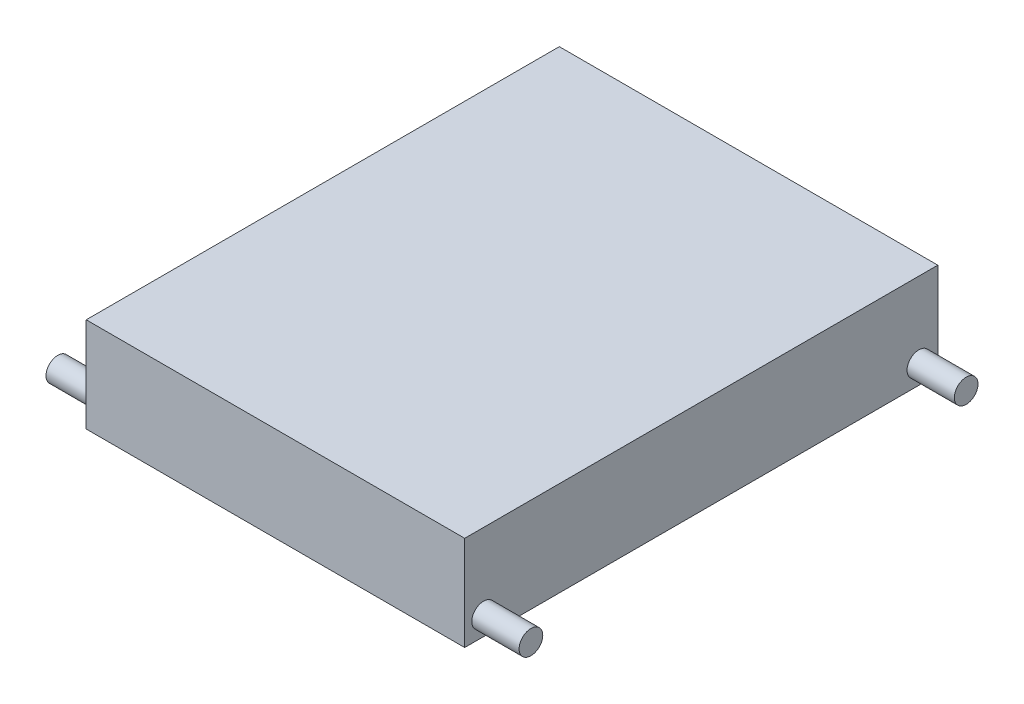
ISO-10303-21;
HEADER;
FILE_DESCRIPTION(('STEP AP214'),'2;1');
FILE_NAME('part.step','',(''),(''),'','','');
FILE_SCHEMA(('AUTOMOTIVE_DESIGN { 1 0 10303 214 1 1 1 1 }'));
ENDSEC;
DATA;
#1=APPLICATION_CONTEXT('core data for automotive mechanical design processes');
#2=APPLICATION_PROTOCOL_DEFINITION('international standard','automotive_design',2000,#1);
#3=PRODUCT_CONTEXT('',#1,'mechanical');
#4=PRODUCT('Part','Part','',(#3));
#5=PRODUCT_RELATED_PRODUCT_CATEGORY('part','',(#4));
#6=PRODUCT_DEFINITION_FORMATION('','',#4);
#7=PRODUCT_DEFINITION_CONTEXT('part definition',#1,'design');
#8=PRODUCT_DEFINITION('design','',#6,#7);
#9=PRODUCT_DEFINITION_SHAPE('','',#8);
#10=(LENGTH_UNIT() NAMED_UNIT(*) SI_UNIT(.MILLI.,.METRE.));
#11=(NAMED_UNIT(*) PLANE_ANGLE_UNIT() SI_UNIT($,.RADIAN.));
#12=(NAMED_UNIT(*) SI_UNIT($,.STERADIAN.) SOLID_ANGLE_UNIT());
#13=UNCERTAINTY_MEASURE_WITH_UNIT(LENGTH_MEASURE(1.E-05),#10,'distance_accuracy_value','');
#14=(GEOMETRIC_REPRESENTATION_CONTEXT(3) GLOBAL_UNCERTAINTY_ASSIGNED_CONTEXT((#13)) GLOBAL_UNIT_ASSIGNED_CONTEXT((#10,
#11,#12)) REPRESENTATION_CONTEXT('',''));
#15=CARTESIAN_POINT('',(0.,0.,0.));
#16=DIRECTION('',(0.,0.,1.));
#17=DIRECTION('',(1.,0.,0.));
#18=AXIS2_PLACEMENT_3D('',#15,#16,#17);
#19=CARTESIAN_POINT('',(-38.127078891258,25.4,18.3703198294243));
#20=DIRECTION('',(1.,0.,0.));
#21=DIRECTION('',(0.,0.,-1.));
#22=AXIS2_PLACEMENT_3D('',#19,#20,#21);
#23=PLANE('',#22);
#24=CARTESIAN_POINT('',(-38.127078891258,5.08,13.2903198294243));
#25=DIRECTION('',(1.,0.,0.));
#26=DIRECTION('',(0.,0.,-1.));
#27=AXIS2_PLACEMENT_3D('',#24,#25,#26);
#28=CIRCLE('',#27,3.175);
#29=CARTESIAN_POINT('',(-38.127078891258,5.08,10.1153198294243));
#30=VERTEX_POINT('',#29);
#31=EDGE_CURVE('E11',#30,#30,#28,.F.);
#32=ORIENTED_EDGE('',*,*,#31,.F.);
#33=EDGE_LOOP('',(#32));
#34=FACE_BOUND('',#33,.T.);
#35=CARTESIAN_POINT('',(-38.127078891258,5.08,-103.549680170576));
#36=DIRECTION('',(1.,0.,0.));
#37=DIRECTION('',(0.,0.,-1.));
#38=AXIS2_PLACEMENT_3D('',#35,#36,#37);
#39=CIRCLE('',#38,3.175);
#40=CARTESIAN_POINT('',(-38.127078891258,5.08,-106.724680170576));
#41=VERTEX_POINT('',#40);
#42=EDGE_CURVE('E54',#41,#41,#39,.F.);
#43=ORIENTED_EDGE('',*,*,#42,.F.);
#44=EDGE_LOOP('',(#43));
#45=FACE_BOUND('',#44,.T.);
#46=DIRECTION('',(0.,0.,1.));
#47=VECTOR('',#46,1.);
#48=CARTESIAN_POINT('',(-38.127078891258,0.,18.3703198294243));
#49=LINE('',#48,#47);
#50=CARTESIAN_POINT('',(-38.127078891258,0.,-108.629680170576));
#51=VERTEX_POINT('',#50);
#52=CARTESIAN_POINT('',(-38.127078891258,0.,18.3703198294243));
#53=VERTEX_POINT('',#52);
#54=EDGE_CURVE('E117',#51,#53,#49,.T.);
#55=ORIENTED_EDGE('',*,*,#54,.T.);
#56=DIRECTION('',(0.,-1.,0.));
#57=VECTOR('',#56,1.);
#58=CARTESIAN_POINT('',(-38.127078891258,25.4,18.3703198294243));
#59=LINE('',#58,#57);
#60=CARTESIAN_POINT('',(-38.127078891258,25.4,18.3703198294243));
#61=VERTEX_POINT('',#60);
#62=EDGE_CURVE('E106',#61,#53,#59,.T.);
#63=ORIENTED_EDGE('',*,*,#62,.F.);
#64=DIRECTION('',(0.,0.,1.));
#65=VECTOR('',#64,1.);
#66=CARTESIAN_POINT('',(-38.127078891258,25.4,18.3703198294243));
#67=LINE('',#66,#65);
#68=CARTESIAN_POINT('',(-38.127078891258,25.4,-108.629680170576));
#69=VERTEX_POINT('',#68);
#70=EDGE_CURVE('E98',#69,#61,#67,.T.);
#71=ORIENTED_EDGE('',*,*,#70,.F.);
#72=DIRECTION('',(0.,-1.,0.));
#73=VECTOR('',#72,1.);
#74=CARTESIAN_POINT('',(-38.127078891258,25.4,-108.629680170576));
#75=LINE('',#74,#73);
#76=EDGE_CURVE('E113',#69,#51,#75,.T.);
#77=ORIENTED_EDGE('',*,*,#76,.T.);
#78=EDGE_LOOP('',(#55,#63,#71,#77));
#79=FACE_BOUND('',#78,.T.);
#80=ADVANCED_FACE('F45',(#34,#45,#79),#23,.F.);
#81=CARTESIAN_POINT('',(-38.127078891258,25.4,18.3703198294243));
#82=DIRECTION('',(0.,0.,-1.));
#83=DIRECTION('',(-1.,0.,0.));
#84=AXIS2_PLACEMENT_3D('',#81,#82,#83);
#85=PLANE('',#84);
#86=DIRECTION('',(1.,0.,0.));
#87=VECTOR('',#86,1.);
#88=CARTESIAN_POINT('',(-38.127078891258,0.,18.3703198294243));
#89=LINE('',#88,#87);
#90=CARTESIAN_POINT('',(63.472921108742,0.,18.3703198294243));
#91=VERTEX_POINT('',#90);
#92=EDGE_CURVE('E104',#53,#91,#89,.T.);
#93=ORIENTED_EDGE('',*,*,#92,.T.);
#94=DIRECTION('',(0.,-1.,0.));
#95=VECTOR('',#94,1.);
#96=CARTESIAN_POINT('',(63.472921108742,25.4,18.3703198294243));
#97=LINE('',#96,#95);
#98=CARTESIAN_POINT('',(63.472921108742,25.4,18.3703198294243));
#99=VERTEX_POINT('',#98);
#100=EDGE_CURVE('E102',#99,#91,#97,.T.);
#101=ORIENTED_EDGE('',*,*,#100,.F.);
#102=DIRECTION('',(1.,0.,0.));
#103=VECTOR('',#102,1.);
#104=CARTESIAN_POINT('',(-38.127078891258,25.4,18.3703198294243));
#105=LINE('',#104,#103);
#106=EDGE_CURVE('E93',#61,#99,#105,.T.);
#107=ORIENTED_EDGE('',*,*,#106,.F.);
#108=ORIENTED_EDGE('',*,*,#62,.T.);
#109=EDGE_LOOP('',(#93,#101,#107,#108));
#110=FACE_BOUND('',#109,.T.);
#111=ADVANCED_FACE('F103',(#110),#85,.F.);
#112=CARTESIAN_POINT('',(63.472921108742,25.4,18.3703198294243));
#113=DIRECTION('',(-1.,0.,0.));
#114=DIRECTION('',(0.,0.,1.));
#115=AXIS2_PLACEMENT_3D('',#112,#113,#114);
#116=PLANE('',#115);
#117=CARTESIAN_POINT('',(63.472921108742,5.08,-103.549680170576));
#118=DIRECTION('',(-1.,0.,0.));
#119=DIRECTION('',(0.,0.,1.));
#120=AXIS2_PLACEMENT_3D('',#117,#118,#119);
#121=CIRCLE('',#120,3.175);
#122=CARTESIAN_POINT('',(63.472921108742,5.08,-100.374680170576));
#123=VERTEX_POINT('',#122);
#124=EDGE_CURVE('E138',#123,#123,#121,.F.);
#125=ORIENTED_EDGE('',*,*,#124,.F.);
#126=EDGE_LOOP('',(#125));
#127=FACE_BOUND('',#126,.T.);
#128=CARTESIAN_POINT('',(63.472921108742,5.08,13.2903198294243));
#129=DIRECTION('',(-1.,0.,0.));
#130=DIRECTION('',(0.,0.,1.));
#131=AXIS2_PLACEMENT_3D('',#128,#129,#130);
#132=CIRCLE('',#131,3.175);
#133=CARTESIAN_POINT('',(63.472921108742,5.08,16.4653198294243));
#134=VERTEX_POINT('',#133);
#135=EDGE_CURVE('E134',#134,#134,#132,.F.);
#136=ORIENTED_EDGE('',*,*,#135,.F.);
#137=EDGE_LOOP('',(#136));
#138=FACE_BOUND('',#137,.T.);
#139=DIRECTION('',(0.,0.,-1.));
#140=VECTOR('',#139,1.);
#141=CARTESIAN_POINT('',(63.472921108742,0.,18.3703198294243));
#142=LINE('',#141,#140);
#143=CARTESIAN_POINT('',(63.472921108742,0.,-108.629680170576));
#144=VERTEX_POINT('',#143);
#145=EDGE_CURVE('E79',#91,#144,#142,.T.);
#146=ORIENTED_EDGE('',*,*,#145,.T.);
#147=DIRECTION('',(0.,-1.,0.));
#148=VECTOR('',#147,1.);
#149=CARTESIAN_POINT('',(63.472921108742,25.4,-108.629680170576));
#150=LINE('',#149,#148);
#151=CARTESIAN_POINT('',(63.472921108742,25.4,-108.629680170576));
#152=VERTEX_POINT('',#151);
#153=EDGE_CURVE('E107',#152,#144,#150,.T.);
#154=ORIENTED_EDGE('',*,*,#153,.F.);
#155=DIRECTION('',(0.,0.,-1.));
#156=VECTOR('',#155,1.);
#157=CARTESIAN_POINT('',(63.472921108742,25.4,18.3703198294243));
#158=LINE('',#157,#156);
#159=EDGE_CURVE('E96',#99,#152,#158,.T.);
#160=ORIENTED_EDGE('',*,*,#159,.F.);
#161=ORIENTED_EDGE('',*,*,#100,.T.);
#162=EDGE_LOOP('',(#146,#154,#160,#161));
#163=FACE_BOUND('',#162,.T.);
#164=ADVANCED_FACE('F109',(#127,#138,#163),#116,.F.);
#165=CARTESIAN_POINT('',(-38.127078891258,25.4,-108.629680170576));
#166=DIRECTION('',(0.,0.,1.));
#167=DIRECTION('',(1.,0.,0.));
#168=AXIS2_PLACEMENT_3D('',#165,#166,#167);
#169=PLANE('',#168);
#170=DIRECTION('',(-1.,0.,0.));
#171=VECTOR('',#170,1.);
#172=CARTESIAN_POINT('',(-38.127078891258,0.,-108.629680170576));
#173=LINE('',#172,#171);
#174=EDGE_CURVE('E85',#144,#51,#173,.T.);
#175=ORIENTED_EDGE('',*,*,#174,.T.);
#176=ORIENTED_EDGE('',*,*,#76,.F.);
#177=DIRECTION('',(-1.,0.,0.));
#178=VECTOR('',#177,1.);
#179=CARTESIAN_POINT('',(-38.127078891258,25.4,-108.629680170576));
#180=LINE('',#179,#178);
#181=EDGE_CURVE('E62',#152,#69,#180,.T.);
#182=ORIENTED_EDGE('',*,*,#181,.F.);
#183=ORIENTED_EDGE('',*,*,#153,.T.);
#184=EDGE_LOOP('',(#175,#176,#182,#183));
#185=FACE_BOUND('',#184,.T.);
#186=ADVANCED_FACE('F163',(#185),#169,.F.);
#187=CARTESIAN_POINT('',(0.,25.4,0.));
#188=DIRECTION('',(0.,-1.,0.));
#189=DIRECTION('',(0.,0.,-1.));
#190=AXIS2_PLACEMENT_3D('',#187,#188,#189);
#191=PLANE('',#190);
#192=ORIENTED_EDGE('',*,*,#70,.T.);
#193=ORIENTED_EDGE('',*,*,#106,.T.);
#194=ORIENTED_EDGE('',*,*,#159,.T.);
#195=ORIENTED_EDGE('',*,*,#181,.T.);
#196=EDGE_LOOP('',(#192,#193,#194,#195));
#197=FACE_BOUND('',#196,.T.);
#198=ADVANCED_FACE('F94',(#197),#191,.F.);
#199=CARTESIAN_POINT('',(0.,0.,0.));
#200=DIRECTION('',(0.,-1.,0.));
#201=DIRECTION('',(0.,0.,-1.));
#202=AXIS2_PLACEMENT_3D('',#199,#200,#201);
#203=PLANE('',#202);
#204=ORIENTED_EDGE('',*,*,#54,.F.);
#205=ORIENTED_EDGE('',*,*,#174,.F.);
#206=ORIENTED_EDGE('',*,*,#145,.F.);
#207=ORIENTED_EDGE('',*,*,#92,.F.);
#208=EDGE_LOOP('',(#204,#205,#206,#207));
#209=FACE_BOUND('',#208,.T.);
#210=ADVANCED_FACE('F152',(#209),#203,.T.);
#211=CARTESIAN_POINT('',(76.172921108742,5.08,13.2903198294243));
#212=DIRECTION('',(-1.,0.,0.));
#213=DIRECTION('',(0.,0.,1.));
#214=AXIS2_PLACEMENT_3D('',#211,#212,#213);
#215=CYLINDRICAL_SURFACE('',#214,3.175);
#216=CARTESIAN_POINT('',(76.172921108742,5.08,13.2903198294243));
#217=DIRECTION('',(1.,0.,0.));
#218=DIRECTION('',(0.,0.,-1.));
#219=AXIS2_PLACEMENT_3D('',#216,#217,#218);
#220=CIRCLE('',#219,3.175);
#221=CARTESIAN_POINT('',(76.172921108742,5.08,10.1153198294243));
#222=VERTEX_POINT('',#221);
#223=EDGE_CURVE('E121',#222,#222,#220,.T.);
#224=ORIENTED_EDGE('',*,*,#223,.F.);
#225=EDGE_LOOP('',(#224));
#226=FACE_BOUND('',#225,.T.);
#227=ORIENTED_EDGE('',*,*,#135,.T.);
#228=EDGE_LOOP('',(#227));
#229=FACE_BOUND('',#228,.T.);
#230=ADVANCED_FACE('F154',(#226,#229),#215,.T.);
#231=CARTESIAN_POINT('',(76.172921108742,5.08,13.2903198294243));
#232=DIRECTION('',(1.,0.,0.));
#233=DIRECTION('',(0.,0.,-1.));
#234=AXIS2_PLACEMENT_3D('',#231,#232,#233);
#235=PLANE('',#234);
#236=ORIENTED_EDGE('',*,*,#223,.T.);
#237=EDGE_LOOP('',(#236));
#238=FACE_BOUND('',#237,.T.);
#239=ADVANCED_FACE('F160',(#238),#235,.T.);
#240=CARTESIAN_POINT('',(76.172921108742,5.08,-103.549680170576));
#241=DIRECTION('',(-1.,0.,0.));
#242=DIRECTION('',(0.,0.,1.));
#243=AXIS2_PLACEMENT_3D('',#240,#241,#242);
#244=CYLINDRICAL_SURFACE('',#243,3.175);
#245=CARTESIAN_POINT('',(76.172921108742,5.08,-103.549680170576));
#246=DIRECTION('',(1.,0.,0.));
#247=DIRECTION('',(0.,0.,-1.));
#248=AXIS2_PLACEMENT_3D('',#245,#246,#247);
#249=CIRCLE('',#248,3.175);
#250=CARTESIAN_POINT('',(76.172921108742,5.08,-106.724680170576));
#251=VERTEX_POINT('',#250);
#252=EDGE_CURVE('E275',#251,#251,#249,.T.);
#253=ORIENTED_EDGE('',*,*,#252,.F.);
#254=EDGE_LOOP('',(#253));
#255=FACE_BOUND('',#254,.T.);
#256=ORIENTED_EDGE('',*,*,#124,.T.);
#257=EDGE_LOOP('',(#256));
#258=FACE_BOUND('',#257,.T.);
#259=ADVANCED_FACE('F205',(#255,#258),#244,.T.);
#260=CARTESIAN_POINT('',(76.172921108742,5.08,-103.549680170576));
#261=DIRECTION('',(1.,0.,0.));
#262=DIRECTION('',(0.,0.,-1.));
#263=AXIS2_PLACEMENT_3D('',#260,#261,#262);
#264=PLANE('',#263);
#265=ORIENTED_EDGE('',*,*,#252,.T.);
#266=EDGE_LOOP('',(#265));
#267=FACE_BOUND('',#266,.T.);
#268=ADVANCED_FACE('F215',(#267),#264,.T.);
#269=CARTESIAN_POINT('',(-50.827078891258,5.08,-103.549680170576));
#270=DIRECTION('',(1.,0.,0.));
#271=DIRECTION('',(0.,0.,-1.));
#272=AXIS2_PLACEMENT_3D('',#269,#270,#271);
#273=CYLINDRICAL_SURFACE('',#272,3.175);
#274=CARTESIAN_POINT('',(-50.827078891258,5.08,-103.549680170576));
#275=DIRECTION('',(-1.,0.,0.));
#276=DIRECTION('',(0.,0.,1.));
#277=AXIS2_PLACEMENT_3D('',#274,#275,#276);
#278=CIRCLE('',#277,3.175);
#279=CARTESIAN_POINT('',(-50.827078891258,5.08,-100.374680170576));
#280=VERTEX_POINT('',#279);
#281=EDGE_CURVE('E271',#280,#280,#278,.T.);
#282=ORIENTED_EDGE('',*,*,#281,.F.);
#283=EDGE_LOOP('',(#282));
#284=FACE_BOUND('',#283,.T.);
#285=ORIENTED_EDGE('',*,*,#42,.T.);
#286=EDGE_LOOP('',(#285));
#287=FACE_BOUND('',#286,.T.);
#288=ADVANCED_FACE('F145',(#284,#287),#273,.T.);
#289=CARTESIAN_POINT('',(-50.827078891258,5.08,-103.549680170576));
#290=DIRECTION('',(-1.,0.,0.));
#291=DIRECTION('',(0.,0.,1.));
#292=AXIS2_PLACEMENT_3D('',#289,#290,#291);
#293=PLANE('',#292);
#294=ORIENTED_EDGE('',*,*,#281,.T.);
#295=EDGE_LOOP('',(#294));
#296=FACE_BOUND('',#295,.T.);
#297=ADVANCED_FACE('F234',(#296),#293,.T.);
#298=CARTESIAN_POINT('',(-50.827078891258,5.08,13.2903198294243));
#299=DIRECTION('',(1.,0.,0.));
#300=DIRECTION('',(0.,0.,-1.));
#301=AXIS2_PLACEMENT_3D('',#298,#299,#300);
#302=CYLINDRICAL_SURFACE('',#301,3.175);
#303=CARTESIAN_POINT('',(-50.827078891258,5.08,13.2903198294243));
#304=DIRECTION('',(-1.,0.,0.));
#305=DIRECTION('',(0.,0.,1.));
#306=AXIS2_PLACEMENT_3D('',#303,#304,#305);
#307=CIRCLE('',#306,3.175);
#308=CARTESIAN_POINT('',(-50.827078891258,5.08,16.4653198294243));
#309=VERTEX_POINT('',#308);
#310=EDGE_CURVE('E269',#309,#309,#307,.T.);
#311=ORIENTED_EDGE('',*,*,#310,.F.);
#312=EDGE_LOOP('',(#311));
#313=FACE_BOUND('',#312,.T.);
#314=ORIENTED_EDGE('',*,*,#31,.T.);
#315=EDGE_LOOP('',(#314));
#316=FACE_BOUND('',#315,.T.);
#317=ADVANCED_FACE('F244',(#313,#316),#302,.T.);
#318=CARTESIAN_POINT('',(-50.827078891258,5.08,13.2903198294243));
#319=DIRECTION('',(-1.,0.,0.));
#320=DIRECTION('',(0.,0.,1.));
#321=AXIS2_PLACEMENT_3D('',#318,#319,#320);
#322=PLANE('',#321);
#323=ORIENTED_EDGE('',*,*,#310,.T.);
#324=EDGE_LOOP('',(#323));
#325=FACE_BOUND('',#324,.T.);
#326=ADVANCED_FACE('F254',(#325),#322,.T.);
#327=CLOSED_SHELL('',(#80,#111,#164,#186,#198,#210,#230,#239,#259,#268,#288,#297,#317,#326));
#328=MANIFOLD_SOLID_BREP('B2',#327);
#329=ADVANCED_BREP_SHAPE_REPRESENTATION('',(#18,#328),#14);
#330=SHAPE_DEFINITION_REPRESENTATION(#9,#329);
ENDSEC;
END-ISO-10303-21;
